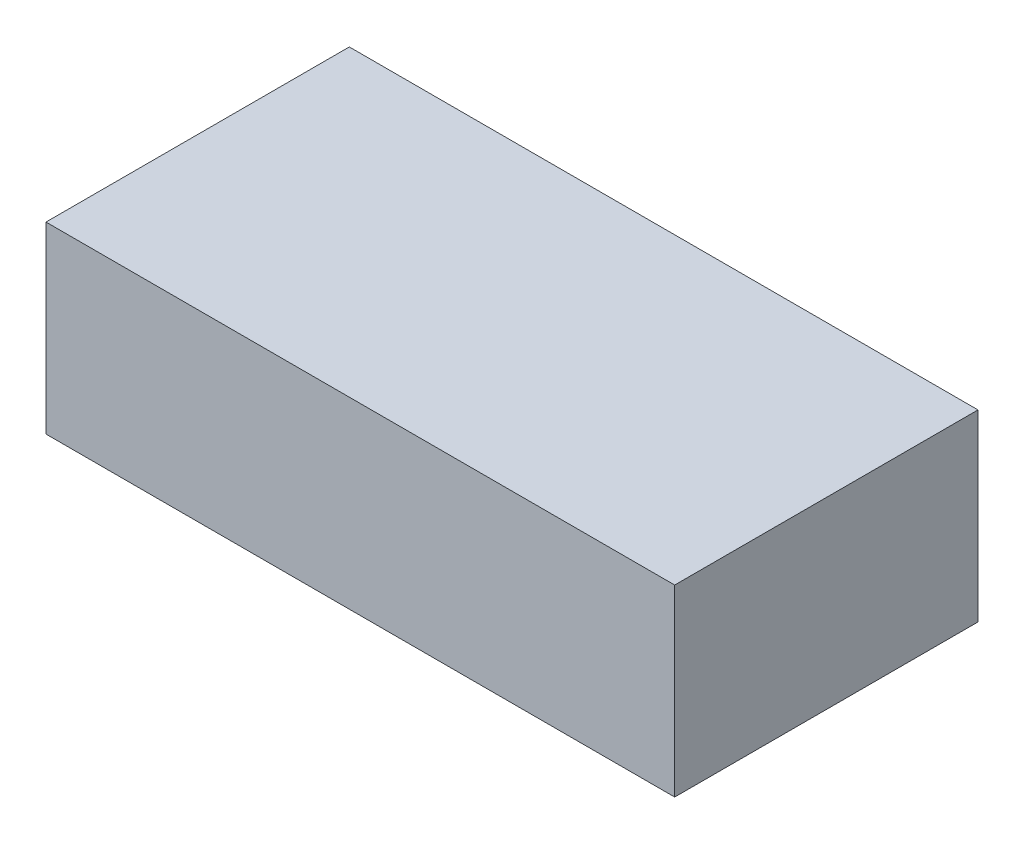
ISO-10303-21;
HEADER;
FILE_DESCRIPTION(('STEP AP214'),'2;1');
FILE_NAME('part.step','',(''),(''),'','','');
FILE_SCHEMA(('AUTOMOTIVE_DESIGN { 1 0 10303 214 1 1 1 1 }'));
ENDSEC;
DATA;
#1=APPLICATION_CONTEXT('core data for automotive mechanical design processes');
#2=APPLICATION_PROTOCOL_DEFINITION('international standard','automotive_design',2000,#1);
#3=PRODUCT_CONTEXT('',#1,'mechanical');
#4=PRODUCT('Part','Part','',(#3));
#5=PRODUCT_RELATED_PRODUCT_CATEGORY('part','',(#4));
#6=PRODUCT_DEFINITION_FORMATION('','',#4);
#7=PRODUCT_DEFINITION_CONTEXT('part definition',#1,'design');
#8=PRODUCT_DEFINITION('design','',#6,#7);
#9=PRODUCT_DEFINITION_SHAPE('','',#8);
#10=(LENGTH_UNIT() NAMED_UNIT(*) SI_UNIT(.MILLI.,.METRE.));
#11=(NAMED_UNIT(*) PLANE_ANGLE_UNIT() SI_UNIT($,.RADIAN.));
#12=(NAMED_UNIT(*) SI_UNIT($,.STERADIAN.) SOLID_ANGLE_UNIT());
#13=UNCERTAINTY_MEASURE_WITH_UNIT(LENGTH_MEASURE(1.E-05),#10,'distance_accuracy_value','');
#14=(GEOMETRIC_REPRESENTATION_CONTEXT(3) GLOBAL_UNCERTAINTY_ASSIGNED_CONTEXT((#13)) GLOBAL_UNIT_ASSIGNED_CONTEXT((#10,
#11,#12)) REPRESENTATION_CONTEXT('',''));
#15=CARTESIAN_POINT('',(0.,0.,0.));
#16=DIRECTION('',(0.,0.,1.));
#17=DIRECTION('',(1.,0.,0.));
#18=AXIS2_PLACEMENT_3D('',#15,#16,#17);
#19=CARTESIAN_POINT('',(36.195,21.1455,17.4625));
#20=DIRECTION('',(-1.,0.,0.));
#21=DIRECTION('',(0.,0.,1.));
#22=AXIS2_PLACEMENT_3D('',#19,#20,#21);
#23=PLANE('',#22);
#24=DIRECTION('',(0.,0.,-1.));
#25=VECTOR('',#24,1.);
#26=CARTESIAN_POINT('',(36.195,0.,17.4625));
#27=LINE('',#26,#25);
#28=CARTESIAN_POINT('',(36.195,0.,17.4625));
#29=VERTEX_POINT('',#28);
#30=CARTESIAN_POINT('',(36.195,0.,-17.4625));
#31=VERTEX_POINT('',#30);
#32=EDGE_CURVE('E107',#29,#31,#27,.T.);
#33=ORIENTED_EDGE('',*,*,#32,.T.);
#34=DIRECTION('',(0.,-1.,0.));
#35=VECTOR('',#34,1.);
#36=CARTESIAN_POINT('',(36.195,21.1455,-17.4625));
#37=LINE('',#36,#35);
#38=CARTESIAN_POINT('',(36.195,21.1455,-17.4625));
#39=VERTEX_POINT('',#38);
#40=EDGE_CURVE('E11',#39,#31,#37,.T.);
#41=ORIENTED_EDGE('',*,*,#40,.F.);
#42=DIRECTION('',(0.,0.,-1.));
#43=VECTOR('',#42,1.);
#44=CARTESIAN_POINT('',(36.195,21.1455,17.4625));
#45=LINE('',#44,#43);
#46=CARTESIAN_POINT('',(36.195,21.1455,17.4625));
#47=VERTEX_POINT('',#46);
#48=EDGE_CURVE('E91',#47,#39,#45,.T.);
#49=ORIENTED_EDGE('',*,*,#48,.F.);
#50=DIRECTION('',(0.,-1.,0.));
#51=VECTOR('',#50,1.);
#52=CARTESIAN_POINT('',(36.195,21.1455,17.4625));
#53=LINE('',#52,#51);
#54=EDGE_CURVE('E103',#47,#29,#53,.T.);
#55=ORIENTED_EDGE('',*,*,#54,.T.);
#56=EDGE_LOOP('',(#33,#41,#49,#55));
#57=FACE_BOUND('',#56,.T.);
#58=ADVANCED_FACE('F39',(#57),#23,.F.);
#59=CARTESIAN_POINT('',(-36.195,21.1455,-17.4625));
#60=DIRECTION('',(0.,0.,1.));
#61=DIRECTION('',(1.,0.,0.));
#62=AXIS2_PLACEMENT_3D('',#59,#60,#61);
#63=PLANE('',#62);
#64=DIRECTION('',(-1.,0.,0.));
#65=VECTOR('',#64,1.);
#66=CARTESIAN_POINT('',(-36.195,0.,-17.4625));
#67=LINE('',#66,#65);
#68=CARTESIAN_POINT('',(-36.195,0.,-17.4625));
#69=VERTEX_POINT('',#68);
#70=EDGE_CURVE('E96',#31,#69,#67,.T.);
#71=ORIENTED_EDGE('',*,*,#70,.T.);
#72=DIRECTION('',(0.,-1.,0.));
#73=VECTOR('',#72,1.);
#74=CARTESIAN_POINT('',(-36.195,21.1455,-17.4625));
#75=LINE('',#74,#73);
#76=CARTESIAN_POINT('',(-36.195,21.1455,-17.4625));
#77=VERTEX_POINT('',#76);
#78=EDGE_CURVE('E48',#77,#69,#75,.T.);
#79=ORIENTED_EDGE('',*,*,#78,.F.);
#80=DIRECTION('',(-1.,0.,0.));
#81=VECTOR('',#80,1.);
#82=CARTESIAN_POINT('',(-36.195,21.1455,-17.4625));
#83=LINE('',#82,#81);
#84=EDGE_CURVE('E86',#39,#77,#83,.T.);
#85=ORIENTED_EDGE('',*,*,#84,.F.);
#86=ORIENTED_EDGE('',*,*,#40,.T.);
#87=EDGE_LOOP('',(#71,#79,#85,#86));
#88=FACE_BOUND('',#87,.T.);
#89=ADVANCED_FACE('F95',(#88),#63,.F.);
#90=CARTESIAN_POINT('',(-36.195,21.1455,17.4625));
#91=DIRECTION('',(1.,0.,0.));
#92=DIRECTION('',(0.,0.,-1.));
#93=AXIS2_PLACEMENT_3D('',#90,#91,#92);
#94=PLANE('',#93);
#95=DIRECTION('',(0.,0.,1.));
#96=VECTOR('',#95,1.);
#97=CARTESIAN_POINT('',(-36.195,0.,17.4625));
#98=LINE('',#97,#96);
#99=CARTESIAN_POINT('',(-36.195,0.,17.4625));
#100=VERTEX_POINT('',#99);
#101=EDGE_CURVE('E73',#69,#100,#98,.T.);
#102=ORIENTED_EDGE('',*,*,#101,.T.);
#103=DIRECTION('',(0.,-1.,0.));
#104=VECTOR('',#103,1.);
#105=CARTESIAN_POINT('',(-36.195,21.1455,17.4625));
#106=LINE('',#105,#104);
#107=CARTESIAN_POINT('',(-36.195,21.1455,17.4625));
#108=VERTEX_POINT('',#107);
#109=EDGE_CURVE('E98',#108,#100,#106,.T.);
#110=ORIENTED_EDGE('',*,*,#109,.F.);
#111=DIRECTION('',(0.,0.,1.));
#112=VECTOR('',#111,1.);
#113=CARTESIAN_POINT('',(-36.195,21.1455,17.4625));
#114=LINE('',#113,#112);
#115=EDGE_CURVE('E89',#77,#108,#114,.T.);
#116=ORIENTED_EDGE('',*,*,#115,.F.);
#117=ORIENTED_EDGE('',*,*,#78,.T.);
#118=EDGE_LOOP('',(#102,#110,#116,#117));
#119=FACE_BOUND('',#118,.T.);
#120=ADVANCED_FACE('F99',(#119),#94,.F.);
#121=CARTESIAN_POINT('',(-36.195,21.1455,17.4625));
#122=DIRECTION('',(0.,0.,-1.));
#123=DIRECTION('',(-1.,0.,0.));
#124=AXIS2_PLACEMENT_3D('',#121,#122,#123);
#125=PLANE('',#124);
#126=DIRECTION('',(1.,0.,0.));
#127=VECTOR('',#126,1.);
#128=CARTESIAN_POINT('',(-36.195,0.,17.4625));
#129=LINE('',#128,#127);
#130=EDGE_CURVE('E79',#100,#29,#129,.T.);
#131=ORIENTED_EDGE('',*,*,#130,.T.);
#132=ORIENTED_EDGE('',*,*,#54,.F.);
#133=DIRECTION('',(1.,0.,0.));
#134=VECTOR('',#133,1.);
#135=CARTESIAN_POINT('',(-36.195,21.1455,17.4625));
#136=LINE('',#135,#134);
#137=EDGE_CURVE('E56',#108,#47,#136,.T.);
#138=ORIENTED_EDGE('',*,*,#137,.F.);
#139=ORIENTED_EDGE('',*,*,#109,.T.);
#140=EDGE_LOOP('',(#131,#132,#138,#139));
#141=FACE_BOUND('',#140,.T.);
#142=ADVANCED_FACE('F120',(#141),#125,.F.);
#143=CARTESIAN_POINT('',(0.,21.1455,0.));
#144=DIRECTION('',(0.,-1.,0.));
#145=DIRECTION('',(0.,0.,-1.));
#146=AXIS2_PLACEMENT_3D('',#143,#144,#145);
#147=PLANE('',#146);
#148=ORIENTED_EDGE('',*,*,#48,.T.);
#149=ORIENTED_EDGE('',*,*,#84,.T.);
#150=ORIENTED_EDGE('',*,*,#115,.T.);
#151=ORIENTED_EDGE('',*,*,#137,.T.);
#152=EDGE_LOOP('',(#148,#149,#150,#151));
#153=FACE_BOUND('',#152,.T.);
#154=ADVANCED_FACE('F87',(#153),#147,.F.);
#155=CARTESIAN_POINT('',(0.,0.,0.));
#156=DIRECTION('',(0.,-1.,0.));
#157=DIRECTION('',(0.,0.,-1.));
#158=AXIS2_PLACEMENT_3D('',#155,#156,#157);
#159=PLANE('',#158);
#160=ORIENTED_EDGE('',*,*,#32,.F.);
#161=ORIENTED_EDGE('',*,*,#130,.F.);
#162=ORIENTED_EDGE('',*,*,#101,.F.);
#163=ORIENTED_EDGE('',*,*,#70,.F.);
#164=EDGE_LOOP('',(#160,#161,#162,#163));
#165=FACE_BOUND('',#164,.T.);
#166=ADVANCED_FACE('F123',(#165),#159,.T.);
#167=CLOSED_SHELL('',(#58,#89,#120,#142,#154,#166));
#168=MANIFOLD_SOLID_BREP('B2',#167);
#169=ADVANCED_BREP_SHAPE_REPRESENTATION('',(#18,#168),#14);
#170=SHAPE_DEFINITION_REPRESENTATION(#9,#169);
ENDSEC;
END-ISO-10303-21;
